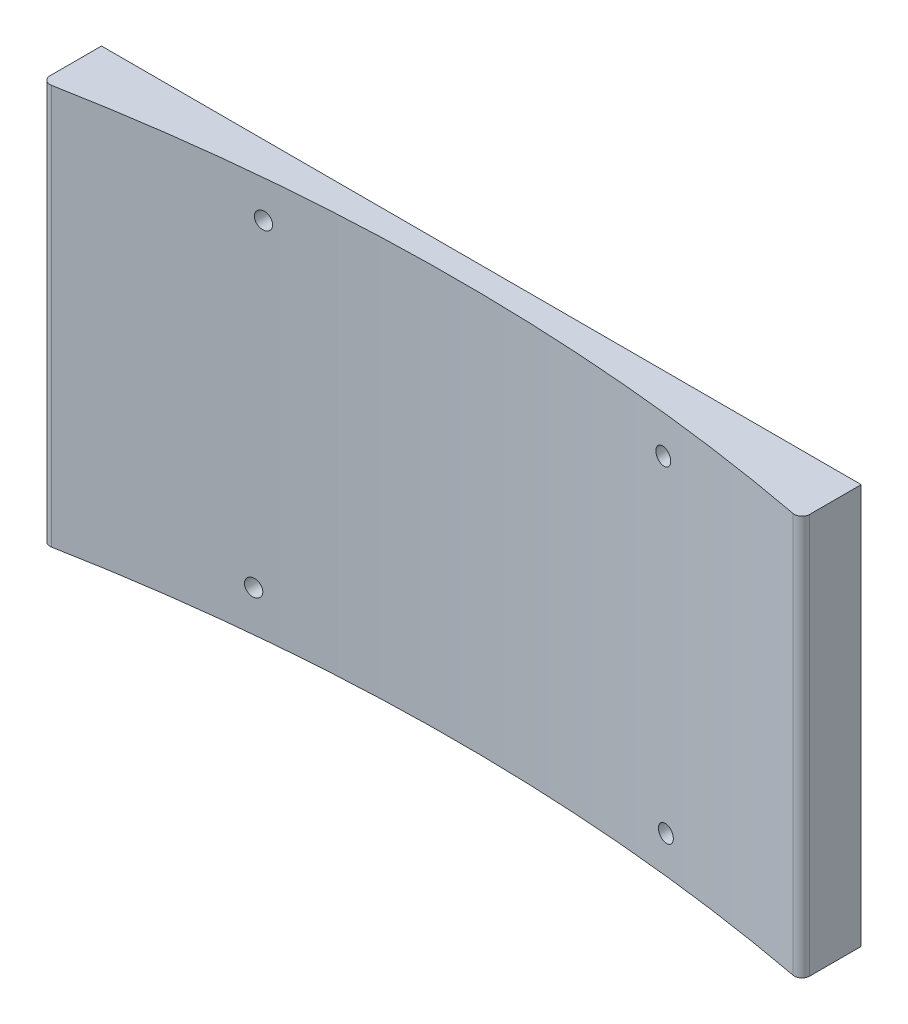
ISO-10303-21;
HEADER;
FILE_DESCRIPTION(('STEP AP214'),'2;1');
FILE_NAME('part.step','',(''),(''),'','','');
FILE_SCHEMA(('AUTOMOTIVE_DESIGN { 1 0 10303 214 1 1 1 1 }'));
ENDSEC;
DATA;
#1=APPLICATION_CONTEXT('core data for automotive mechanical design processes');
#2=APPLICATION_PROTOCOL_DEFINITION('international standard','automotive_design',2000,#1);
#3=PRODUCT_CONTEXT('',#1,'mechanical');
#4=PRODUCT('Part','Part','',(#3));
#5=PRODUCT_RELATED_PRODUCT_CATEGORY('part','',(#4));
#6=PRODUCT_DEFINITION_FORMATION('','',#4);
#7=PRODUCT_DEFINITION_CONTEXT('part definition',#1,'design');
#8=PRODUCT_DEFINITION('design','',#6,#7);
#9=PRODUCT_DEFINITION_SHAPE('','',#8);
#10=(LENGTH_UNIT() NAMED_UNIT(*) SI_UNIT(.MILLI.,.METRE.));
#11=(NAMED_UNIT(*) PLANE_ANGLE_UNIT() SI_UNIT($,.RADIAN.));
#12=(NAMED_UNIT(*) SI_UNIT($,.STERADIAN.) SOLID_ANGLE_UNIT());
#13=UNCERTAINTY_MEASURE_WITH_UNIT(LENGTH_MEASURE(1.E-05),#10,'distance_accuracy_value','');
#14=(GEOMETRIC_REPRESENTATION_CONTEXT(3) GLOBAL_UNCERTAINTY_ASSIGNED_CONTEXT((#13)) GLOBAL_UNIT_ASSIGNED_CONTEXT((#10,
#11,#12)) REPRESENTATION_CONTEXT('',''));
#15=CARTESIAN_POINT('',(0.,0.,0.));
#16=DIRECTION('',(0.,0.,1.));
#17=DIRECTION('',(1.,0.,0.));
#18=AXIS2_PLACEMENT_3D('',#15,#16,#17);
#19=CARTESIAN_POINT('',(-141.572,27.78,22.));
#20=DIRECTION('',(1.,0.,0.));
#21=DIRECTION('',(0.,0.,-1.));
#22=AXIS2_PLACEMENT_3D('',#19,#20,#21);
#23=PLANE('',#22);
#24=DIRECTION('',(0.,0.,1.));
#25=VECTOR('',#24,1.);
#26=CARTESIAN_POINT('',(-141.572,27.784,0.));
#27=LINE('',#26,#25);
#28=CARTESIAN_POINT('',(-141.572,27.782,22.));
#29=VERTEX_POINT('',#28);
#30=CARTESIAN_POINT('',(-141.572,27.784,26.7911007728322));
#31=VERTEX_POINT('',#30);
#32=EDGE_CURVE('E99',#29,#31,#27,.T.);
#33=ORIENTED_EDGE('',*,*,#32,.T.);
#34=DIRECTION('',(0.,1.,0.));
#35=VECTOR('',#34,1.);
#36=CARTESIAN_POINT('',(-141.572,27.78,26.7911007728322));
#37=LINE('',#36,#35);
#38=CARTESIAN_POINT('',(-141.572,80.424,26.7911007728322));
#39=VERTEX_POINT('',#38);
#40=EDGE_CURVE('E163',#31,#39,#37,.T.);
#41=ORIENTED_EDGE('',*,*,#40,.T.);
#42=DIRECTION('',(0.,0.,-1.));
#43=VECTOR('',#42,1.);
#44=CARTESIAN_POINT('',(-141.572,80.424,22.));
#45=LINE('',#44,#43);
#46=CARTESIAN_POINT('',(-141.572,80.424,20.));
#47=VERTEX_POINT('',#46);
#48=EDGE_CURVE('E105',#39,#47,#45,.T.);
#49=ORIENTED_EDGE('',*,*,#48,.T.);
#50=DIRECTION('',(0.,-1.,0.));
#51=VECTOR('',#50,1.);
#52=CARTESIAN_POINT('',(-141.572,27.78,20.));
#53=LINE('',#52,#51);
#54=CARTESIAN_POINT('',(-141.572,27.78,20.));
#55=VERTEX_POINT('',#54);
#56=EDGE_CURVE('E102',#47,#55,#53,.T.);
#57=ORIENTED_EDGE('',*,*,#56,.T.);
#58=DIRECTION('',(0.,0.,-1.));
#59=VECTOR('',#58,1.);
#60=CARTESIAN_POINT('',(-141.572,27.78,22.));
#61=LINE('',#60,#59);
#62=EDGE_CURVE('E95',#29,#55,#61,.T.);
#63=ORIENTED_EDGE('',*,*,#62,.F.);
#64=EDGE_LOOP('',(#33,#41,#49,#57,#63));
#65=FACE_BOUND('',#64,.T.);
#66=ADVANCED_FACE('F36',(#65),#23,.F.);
#67=CARTESIAN_POINT('',(-41.572,27.78,22.));
#68=DIRECTION('',(0.,1.,0.));
#69=DIRECTION('',(0.,0.,1.));
#70=AXIS2_PLACEMENT_3D('',#67,#68,#69);
#71=PLANE('',#70);
#72=DIRECTION('',(1.,0.,0.));
#73=VECTOR('',#72,1.);
#74=CARTESIAN_POINT('',(-41.572,27.78,20.));
#75=LINE('',#74,#73);
#76=CARTESIAN_POINT('',(-41.572,27.78,20.));
#77=VERTEX_POINT('',#76);
#78=EDGE_CURVE('E125',#55,#77,#75,.T.);
#79=ORIENTED_EDGE('',*,*,#78,.T.);
#80=DIRECTION('',(0.,0.,-1.));
#81=VECTOR('',#80,1.);
#82=CARTESIAN_POINT('',(-41.572,27.78,22.));
#83=LINE('',#82,#81);
#84=CARTESIAN_POINT('',(-41.572,27.782,22.));
#85=VERTEX_POINT('',#84);
#86=EDGE_CURVE('E106',#85,#77,#83,.T.);
#87=ORIENTED_EDGE('',*,*,#86,.F.);
#88=CARTESIAN_POINT('',(-141.572,27.784,22.));
#89=DIRECTION('',(1.,0.,0.));
#90=VECTOR('',#89,1.);
#91=LINE('',#88,#90);
#92=EDGE_CURVE('E109',#29,#85,#91,.T.);
#93=ORIENTED_EDGE('',*,*,#92,.F.);
#94=ORIENTED_EDGE('',*,*,#62,.T.);
#95=EDGE_LOOP('',(#79,#87,#93,#94));
#96=FACE_BOUND('',#95,.T.);
#97=ADVANCED_FACE('F111',(#96),#71,.F.);
#98=CARTESIAN_POINT('',(-41.572,80.424,22.));
#99=DIRECTION('',(-1.,0.,0.));
#100=DIRECTION('',(0.,0.,1.));
#101=AXIS2_PLACEMENT_3D('',#98,#99,#100);
#102=PLANE('',#101);
#103=DIRECTION('',(0.,0.,-1.));
#104=VECTOR('',#103,1.);
#105=CARTESIAN_POINT('',(-41.572,80.424,22.));
#106=LINE('',#105,#104);
#107=CARTESIAN_POINT('',(-41.572,80.424,26.7911007728322));
#108=VERTEX_POINT('',#107);
#109=CARTESIAN_POINT('',(-41.572,80.424,20.));
#110=VERTEX_POINT('',#109);
#111=EDGE_CURVE('E117',#108,#110,#106,.T.);
#112=ORIENTED_EDGE('',*,*,#111,.F.);
#113=DIRECTION('',(0.,1.,0.));
#114=VECTOR('',#113,1.);
#115=CARTESIAN_POINT('',(-41.572,80.424,26.7911007728322));
#116=LINE('',#115,#114);
#117=CARTESIAN_POINT('',(-41.572,27.784,26.7911007728322));
#118=VERTEX_POINT('',#117);
#119=EDGE_CURVE('E149',#108,#118,#116,.F.);
#120=ORIENTED_EDGE('',*,*,#119,.T.);
#121=DIRECTION('',(0.,0.,1.));
#122=VECTOR('',#121,1.);
#123=CARTESIAN_POINT('',(-41.572,27.784,0.));
#124=LINE('',#123,#122);
#125=EDGE_CURVE('E123',#85,#118,#124,.T.);
#126=ORIENTED_EDGE('',*,*,#125,.F.);
#127=ORIENTED_EDGE('',*,*,#86,.T.);
#128=DIRECTION('',(0.,1.,0.));
#129=VECTOR('',#128,1.);
#130=CARTESIAN_POINT('',(-41.572,80.424,20.));
#131=LINE('',#130,#129);
#132=EDGE_CURVE('E139',#77,#110,#131,.T.);
#133=ORIENTED_EDGE('',*,*,#132,.T.);
#134=EDGE_LOOP('',(#112,#120,#126,#127,#133));
#135=FACE_BOUND('',#134,.T.);
#136=ADVANCED_FACE('F173',(#135),#102,.F.);
#137=CARTESIAN_POINT('',(-121.572,80.424,22.));
#138=DIRECTION('',(0.,-1.,0.));
#139=DIRECTION('',(0.,0.,-1.));
#140=AXIS2_PLACEMENT_3D('',#137,#138,#139);
#141=PLANE('',#140);
#142=ORIENTED_EDGE('',*,*,#48,.F.);
#143=CARTESIAN_POINT('',(-140.572,80.424,26.7911007728322));
#144=DIRECTION('',(0.,-1.,0.));
#145=DIRECTION('',(0.,0.,-1.));
#146=AXIS2_PLACEMENT_3D('',#143,#144,#145);
#147=CIRCLE('',#146,1.);
#148=CARTESIAN_POINT('',(-140.386780302292,80.424,27.7737979100932));
#149=VERTEX_POINT('',#148);
#150=EDGE_CURVE('E58',#39,#149,#147,.F.);
#151=ORIENTED_EDGE('',*,*,#150,.T.);
#152=CARTESIAN_POINT('',(-91.572,80.424,286.764312703068));
#153=DIRECTION('',(0.,1.,0.));
#154=DIRECTION('',(0.,0.,1.));
#155=AXIS2_PLACEMENT_3D('',#152,#153,#154);
#156=CIRCLE('',#155,263.550696316081);
#157=CARTESIAN_POINT('',(-42.7572196977076,80.424,27.7737979100932));
#158=VERTEX_POINT('',#157);
#159=EDGE_CURVE('E187',#158,#149,#156,.T.);
#160=ORIENTED_EDGE('',*,*,#159,.F.);
#161=CARTESIAN_POINT('',(-42.572,80.424,26.7911007728322));
#162=DIRECTION('',(0.,-1.,0.));
#163=DIRECTION('',(0.,0.,-1.));
#164=AXIS2_PLACEMENT_3D('',#161,#162,#163);
#165=CIRCLE('',#164,1.);
#166=EDGE_CURVE('E146',#158,#108,#165,.F.);
#167=ORIENTED_EDGE('',*,*,#166,.T.);
#168=ORIENTED_EDGE('',*,*,#111,.T.);
#169=DIRECTION('',(-1.,0.,0.));
#170=VECTOR('',#169,1.);
#171=CARTESIAN_POINT('',(-121.572,80.424,20.));
#172=LINE('',#171,#170);
#173=EDGE_CURVE('E118',#110,#47,#172,.T.);
#174=ORIENTED_EDGE('',*,*,#173,.T.);
#175=EDGE_LOOP('',(#142,#151,#160,#167,#168,#174));
#176=FACE_BOUND('',#175,.T.);
#177=ADVANCED_FACE('F166',(#176),#141,.F.);
#178=CARTESIAN_POINT('',(0.,0.,20.));
#179=DIRECTION('',(0.,0.,-1.));
#180=DIRECTION('',(-1.,0.,0.));
#181=AXIS2_PLACEMENT_3D('',#178,#179,#180);
#182=PLANE('',#181);
#183=CARTESIAN_POINT('',(-117.094,33.147,20.));
#184=DIRECTION('',(0.,0.,-1.));
#185=DIRECTION('',(-1.,0.,0.));
#186=AXIS2_PLACEMENT_3D('',#183,#184,#185);
#187=CIRCLE('',#186,1.10000000000001);
#188=CARTESIAN_POINT('',(-118.194,33.147,20.));
#189=VERTEX_POINT('',#188);
#190=EDGE_CURVE('E242',#189,#189,#187,.T.);
#191=ORIENTED_EDGE('',*,*,#190,.F.);
#192=EDGE_LOOP('',(#191));
#193=FACE_BOUND('',#192,.T.);
#194=CARTESIAN_POINT('',(-115.905,75.538,20.));
#195=DIRECTION('',(0.,0.,-1.));
#196=DIRECTION('',(-1.,0.,0.));
#197=AXIS2_PLACEMENT_3D('',#194,#195,#196);
#198=CIRCLE('',#197,1.10000000000001);
#199=CARTESIAN_POINT('',(-117.005,75.538,20.));
#200=VERTEX_POINT('',#199);
#201=EDGE_CURVE('E239',#200,#200,#198,.T.);
#202=ORIENTED_EDGE('',*,*,#201,.F.);
#203=EDGE_LOOP('',(#202));
#204=FACE_BOUND('',#203,.T.);
#205=CARTESIAN_POINT('',(-62.836,75.44,20.));
#206=DIRECTION('',(0.,0.,-1.));
#207=DIRECTION('',(-1.,0.,0.));
#208=AXIS2_PLACEMENT_3D('',#205,#206,#207);
#209=CIRCLE('',#208,1.09999999999999);
#210=CARTESIAN_POINT('',(-63.936,75.44,20.));
#211=VERTEX_POINT('',#210);
#212=EDGE_CURVE('E235',#211,#211,#209,.T.);
#213=ORIENTED_EDGE('',*,*,#212,.F.);
#214=EDGE_LOOP('',(#213));
#215=FACE_BOUND('',#214,.T.);
#216=CARTESIAN_POINT('',(-62.455,32.641,20.));
#217=DIRECTION('',(0.,0.,-1.));
#218=DIRECTION('',(-1.,0.,0.));
#219=AXIS2_PLACEMENT_3D('',#216,#217,#218);
#220=CIRCLE('',#219,1.10000000000001);
#221=CARTESIAN_POINT('',(-63.555,32.641,20.));
#222=VERTEX_POINT('',#221);
#223=EDGE_CURVE('E188',#222,#222,#220,.T.);
#224=ORIENTED_EDGE('',*,*,#223,.F.);
#225=EDGE_LOOP('',(#224));
#226=FACE_BOUND('',#225,.T.);
#227=ORIENTED_EDGE('',*,*,#56,.F.);
#228=ORIENTED_EDGE('',*,*,#173,.F.);
#229=ORIENTED_EDGE('',*,*,#132,.F.);
#230=ORIENTED_EDGE('',*,*,#78,.F.);
#231=EDGE_LOOP('',(#227,#228,#229,#230));
#232=FACE_BOUND('',#231,.T.);
#233=ADVANCED_FACE('F171',(#193,#204,#215,#226,#232),#182,.T.);
#234=CARTESIAN_POINT('',(-91.572,27.784,286.764312703068));
#235=DIRECTION('',(0.,1.,0.));
#236=DIRECTION('',(0.,0.,1.));
#237=AXIS2_PLACEMENT_3D('',#234,#235,#236);
#238=CYLINDRICAL_SURFACE('',#237,263.550696316081);
#239=CARTESIAN_POINT('',(-118.194,33.147,24.5616455833548));
#240=CARTESIAN_POINT('',(-118.193997231463,33.2085555516964,24.5616452826476));
#241=CARTESIAN_POINT('',(-118.188815275005,33.2701558664589,24.5611190065985));
#242=CARTESIAN_POINT('',(-118.168220162618,33.3916556149782,24.5590291851556));
#243=CARTESIAN_POINT('',(-118.152794681111,33.4515529089121,24.5574643901593));
#244=CARTESIAN_POINT('',(-118.11216702735,33.5678642571947,24.5533490168651));
#245=CARTESIAN_POINT('',(-118.086970616105,33.624280341411,24.5507990194526));
#246=CARTESIAN_POINT('',(-118.027538686672,33.7320576020756,24.5447960968553));
#247=CARTESIAN_POINT('',(-117.993305321454,33.7834199785272,24.5413433867352));
#248=CARTESIAN_POINT('',(-117.916687870883,33.8797912786444,24.5336348043414));
#249=CARTESIAN_POINT('',(-117.874284206051,33.9247844804955,24.529377003197));
#250=CARTESIAN_POINT('',(-117.782590510787,34.0070210837525,24.5201962914735));
#251=CARTESIAN_POINT('',(-117.733300053025,34.0442640038915,24.515273339622));
#252=CARTESIAN_POINT('',(-117.628979975498,34.1101301747767,24.5048875536437));
#253=CARTESIAN_POINT('',(-117.573924036482,34.1387113516631,24.4994222502138));
#254=CARTESIAN_POINT('',(-117.459829283006,34.1862247188688,24.4881355404228));
#255=CARTESIAN_POINT('',(-117.400790374738,34.2051566818352,24.4823141256746));
#256=CARTESIAN_POINT('',(-117.280135861158,34.2329104330917,24.4704603790245));
#257=CARTESIAN_POINT('',(-117.218510394955,34.2416890283687,24.4644272577165));
#258=CARTESIAN_POINT('',(-117.094662129304,34.2487471394208,24.4523474454953));
#259=CARTESIAN_POINT('',(-117.032439322585,34.2470265272342,24.4463007544174));
#260=CARTESIAN_POINT('',(-116.909044590183,34.2331184430049,24.4343533958371));
#261=CARTESIAN_POINT('',(-116.847874764961,34.220912076518,24.4284530117256));
#262=CARTESIAN_POINT('',(-116.728443375217,34.186342593976,24.4169733096933));
#263=CARTESIAN_POINT('',(-116.670181806327,34.1639794931749,24.4113939912903));
#264=CARTESIAN_POINT('',(-116.558306184082,34.1097519809911,24.4007154011996));
#265=CARTESIAN_POINT('',(-116.50468629707,34.0778997260523,24.3956155262337));
#266=CARTESIAN_POINT('',(-116.403553915532,34.005573628476,24.3860246471818));
#267=CARTESIAN_POINT('',(-116.356041313138,33.9650999381437,24.3815336323419));
#268=CARTESIAN_POINT('',(-116.268660493225,33.8768337840004,24.373294539686));
#269=CARTESIAN_POINT('',(-116.228765188615,33.829068383156,24.3695438276853));
#270=CARTESIAN_POINT('',(-116.157565152103,33.727463374399,24.3628630160604));
#271=CARTESIAN_POINT('',(-116.126260216053,33.6736239108779,24.3599328969351));
#272=CARTESIAN_POINT('',(-116.073272261741,33.5616502174098,24.3549799901142));
#273=CARTESIAN_POINT('',(-116.051548094155,33.5035356305846,24.3529533216915));
#274=CARTESIAN_POINT('',(-116.018158371233,33.3844614243145,24.3498406302057));
#275=CARTESIAN_POINT('',(-116.006492608898,33.3235018634452,24.3487545877849));
#276=CARTESIAN_POINT('',(-115.993582447782,33.2006817207884,24.3475527920927));
#277=CARTESIAN_POINT('',(-115.992304119523,33.1388247342041,24.3474338797897));
#278=CARTESIAN_POINT('',(-116.000116767138,33.015775276309,24.3481610379342));
#279=CARTESIAN_POINT('',(-116.009207646917,32.9545827988453,24.349007099439));
#280=CARTESIAN_POINT('',(-116.037480100345,32.8346580115302,24.3516414934723));
#281=CARTESIAN_POINT('',(-116.056652153061,32.7759234367767,24.3534289369365));
#282=CARTESIAN_POINT('',(-116.104525117184,32.6625126426723,24.3579002153249));
#283=CARTESIAN_POINT('',(-116.133226076753,32.6078364438359,24.3605840547798));
#284=CARTESIAN_POINT('',(-116.199386536417,32.5039885877137,24.3667851562658));
#285=CARTESIAN_POINT('',(-116.236861044769,32.4548265787147,24.3703038465542));
#286=CARTESIAN_POINT('',(-116.319465520928,32.3634899173461,24.3780817466364));
#287=CARTESIAN_POINT('',(-116.364595627565,32.3213153917193,24.3823409698594));
#288=CARTESIAN_POINT('',(-116.46140737429,32.2449797059683,24.3915067615162));
#289=CARTESIAN_POINT('',(-116.513112885554,32.2108491053513,24.396415691415));
#290=CARTESIAN_POINT('',(-116.621471639376,32.1517483377242,24.40673904113));
#291=CARTESIAN_POINT('',(-116.678124993891,32.1267783780605,24.4121534723844));
#292=CARTESIAN_POINT('',(-116.795032399585,32.0865966875564,24.42336731843));
#293=CARTESIAN_POINT('',(-116.855300916384,32.0714274753744,24.4291682918143));
#294=CARTESIAN_POINT('',(-116.977510905045,32.0514342614529,24.4409753655783));
#295=CARTESIAN_POINT('',(-117.039452413934,32.0466104888699,24.4469814704987));
#296=CARTESIAN_POINT('',(-117.163453947144,32.0474400034424,24.459049877765));
#297=CARTESIAN_POINT('',(-117.225513745399,32.0531257447334,24.4651122964757));
#298=CARTESIAN_POINT('',(-117.347800493205,32.0748795790196,24.4771010175134));
#299=CARTESIAN_POINT('',(-117.408027425686,32.090947768671,24.4830273185727));
#300=CARTESIAN_POINT('',(-117.524963146518,32.1330307222448,24.4945723805497));
#301=CARTESIAN_POINT('',(-117.581670334874,32.1590499717546,24.5001910014685));
#302=CARTESIAN_POINT('',(-117.689912054842,32.2203092774189,24.5109482624326));
#303=CARTESIAN_POINT('',(-117.741446840695,32.2555488800562,24.5160869260685));
#304=CARTESIAN_POINT('',(-117.837728228947,32.3341530376848,24.5257125919688));
#305=CARTESIAN_POINT('',(-117.882492973918,32.3774951554188,24.5302013344835));
#306=CARTESIAN_POINT('',(-117.964115336735,32.4711611236489,24.53840348665));
#307=CARTESIAN_POINT('',(-118.000971167595,32.5214865477738,24.542116721074));
#308=CARTESIAN_POINT('',(-118.065546839812,32.6274500708933,24.5486332388768));
#309=CARTESIAN_POINT('',(-118.093304088928,32.6830651723755,24.5514402473604));
#310=CARTESIAN_POINT('',(-118.139053606155,32.7981607929505,24.5560715563347));
#311=CARTESIAN_POINT('',(-118.157057956815,32.8576364265352,24.5578970727433));
#312=CARTESIAN_POINT('',(-118.177930064706,32.9557514218628,24.560014352219));
#313=CARTESIAN_POINT('',(-118.183948554274,32.9937425314175,24.5606252015279));
#314=CARTESIAN_POINT('',(-118.191984380575,33.0701499445739,24.5614409103997));
#315=CARTESIAN_POINT('',(-118.194001728605,33.108566246975,24.5616457711088));
#316=CARTESIAN_POINT('',(-118.194,33.147,24.5616455833548));
#317=B_SPLINE_CURVE_WITH_KNOTS('',3,(#239,#240,#241,#242,#243,#244,#245,#246,#247,#248,#249,
#250,#251,#252,#253,#254,#255,#256,#257,#258,#259,#260,#261,#262,#263,#264,#265,#266,#267,#268,
#269,#270,#271,#272,#273,#274,#275,#276,#277,#278,#279,#280,#281,#282,#283,#284,#285,#286,#287,
#288,#289,#290,#291,#292,#293,#294,#295,#296,#297,#298,#299,#300,#301,#302,#303,#304,#305,#306,
#307,#308,#309,#310,#311,#312,#313,#314,#315,#316),.UNSPECIFIED.,.T.,.F.,(4,2,2,2,2,2,2,2,2,2,2,
2,2,2,2,2,2,2,2,2,2,2,2,2,2,2,2,2,2,2,2,2,2,2,2,2,2,2,4),(0.,0.184525987399434,0.36927441003708,
0.553914068957335,0.73850977883759,0.923553486941946,1.1086086822189,1.29454887220511,
1.48049344307725,1.66722615680288,1.85396114638611,2.04103332415001,2.22810522095865,
2.41493848525853,2.60176844925855,2.78792114081342,2.9740694081122,3.15941019311999,
3.34474716379537,3.52947850608815,3.71420813642038,3.89876361559019,4.08332002759258,
4.2681944835513,4.45307229249738,4.63864153556624,4.82421497864195,5.01058818460522,
5.19696551878358,5.3839193613811,5.57087494446169,5.75791490004815,5.94494565751492,
6.13146596717461,6.31802837606755,6.50381384317093,6.68936861718028,6.80458237214603,
6.91979580181995),.UNSPECIFIED.);
#318=CARTESIAN_POINT('',(-118.194,33.147,24.5616455833548));
#319=VERTEX_POINT('',#318);
#320=EDGE_CURVE('E152',#319,#319,#317,.T.);
#321=ORIENTED_EDGE('',*,*,#320,.T.);
#322=EDGE_LOOP('',(#321));
#323=FACE_BOUND('',#322,.T.);
#324=CARTESIAN_POINT('',(-117.005,75.538,24.4436462665649));
#325=CARTESIAN_POINT('',(-117.004997233954,75.5995759570914,24.4436459787746));
#326=CARTESIAN_POINT('',(-116.999811876755,75.6611966789202,24.443143097528));
#327=CARTESIAN_POINT('',(-116.979202826321,75.7827370561146,24.4411462151642));
#328=CARTESIAN_POINT('',(-116.963766800378,75.8426545716701,24.4396510201833));
#329=CARTESIAN_POINT('',(-116.923109885125,75.9590059801332,24.4357188157169));
#330=CARTESIAN_POINT('',(-116.897894667373,76.0154418703021,24.4332823521346));
#331=CARTESIAN_POINT('',(-116.838416091165,76.1232560460424,24.4275470088479));
#332=CARTESIAN_POINT('',(-116.804154895695,76.1746355366251,24.4242483353088));
#333=CARTESIAN_POINT('',(-116.727480006184,76.2710262035293,24.4168849731529));
#334=CARTESIAN_POINT('',(-116.685048327812,76.3160229439227,24.4128185951087));
#335=CARTESIAN_POINT('',(-116.593292397187,76.3982613767476,24.404051658889));
#336=CARTESIAN_POINT('',(-116.543967730686,76.4355026027617,24.3993510625997));
#337=CARTESIAN_POINT('',(-116.439596128151,76.5013434253326,24.3894378634571));
#338=CARTESIAN_POINT('',(-116.384525180269,76.529904635777,24.3842231175768));
#339=CARTESIAN_POINT('',(-116.270400728621,76.5773757999327,24.373455750539));
#340=CARTESIAN_POINT('',(-116.211347140158,76.5962855483186,24.3679031221963));
#341=CARTESIAN_POINT('',(-116.090688451282,76.6239861304578,24.3566010619431));
#342=CARTESIAN_POINT('',(-116.029074397446,76.6327376995432,24.3508509542443));
#343=CARTESIAN_POINT('',(-115.905252971229,76.6397464696237,24.3393401980518));
#344=CARTESIAN_POINT('',(-115.843045592436,76.6380035570649,24.3335795494448));
#345=CARTESIAN_POINT('',(-115.719697179104,76.6240577121621,24.3222008140075));
#346=CARTESIAN_POINT('',(-115.658558041183,76.6118377906626,24.3165829739934));
#347=CARTESIAN_POINT('',(-115.539190612602,76.5772519587465,24.3056552019203));
#348=CARTESIAN_POINT('',(-115.480962317895,76.5548860624409,24.300345269433));
#349=CARTESIAN_POINT('',(-115.369148197703,76.5006624171723,24.2901836584288));
#350=CARTESIAN_POINT('',(-115.315556986687,76.4688158753608,24.2853314477042));
#351=CARTESIAN_POINT('',(-115.214480668403,76.3965126008056,24.2762077995785));
#352=CARTESIAN_POINT('',(-115.166995462768,76.3560560067953,24.2719363528214));
#353=CARTESIAN_POINT('',(-115.07965025644,76.2678210666122,24.2640996951364));
#354=CARTESIAN_POINT('',(-115.039765624579,76.2200673073342,24.2605322015277));
#355=CARTESIAN_POINT('',(-114.968584282231,76.118492371144,24.2541783198878));
#356=CARTESIAN_POINT('',(-114.937287387215,76.0646713246378,24.2513919150729));
#357=CARTESIAN_POINT('',(-114.88429915411,75.9527169990297,24.2466810187101));
#358=CARTESIAN_POINT('',(-114.862570558194,75.894601493894,24.2447531836539));
#359=CARTESIAN_POINT('',(-114.829172738837,75.7755268931841,24.2417922815272));
#360=CARTESIAN_POINT('',(-114.817503328436,75.7145678504818,24.2407591978271));
#361=CARTESIAN_POINT('',(-114.804583710757,75.5917295846728,24.2396155303955));
#362=CARTESIAN_POINT('',(-114.803302839298,75.5298536101914,24.2395022317043));
#363=CARTESIAN_POINT('',(-114.81111680916,75.4067659036331,24.2401938235883));
#364=CARTESIAN_POINT('',(-114.820211563587,75.3455541659976,24.2409987064739));
#365=CARTESIAN_POINT('',(-114.848500037544,75.2255854617127,24.2435053867956));
#366=CARTESIAN_POINT('',(-114.867685154276,75.1668264499195,24.2452064201977));
#367=CARTESIAN_POINT('',(-114.915593804205,75.0533687710189,24.2494622050434));
#368=CARTESIAN_POINT('',(-114.944317380627,74.9986701223124,24.2520169603558));
#369=CARTESIAN_POINT('',(-115.010527658875,74.8947902032107,24.2579203008324));
#370=CARTESIAN_POINT('',(-115.048027928923,74.8456176518249,24.2612701152227));
#371=CARTESIAN_POINT('',(-115.130691490146,74.754264579742,24.2686759745392));
#372=CARTESIAN_POINT('',(-115.175854907294,74.7120841740103,24.2727320310753));
#373=CARTESIAN_POINT('',(-115.272723024761,74.6357578483001,24.2814606438742));
#374=CARTESIAN_POINT('',(-115.324449337022,74.6016395912783,24.2861352393034));
#375=CARTESIAN_POINT('',(-115.432851683135,74.5425672371199,24.295967480255));
#376=CARTESIAN_POINT('',(-115.489527818132,74.5176133273002,24.3011251356483));
#377=CARTESIAN_POINT('',(-115.606457861229,74.4774773504902,24.3118068642039));
#378=CARTESIAN_POINT('',(-115.666724886712,74.462333856245,24.3173322906639));
#379=CARTESIAN_POINT('',(-115.788929124715,74.4423902698988,24.3285803105591));
#380=CARTESIAN_POINT('',(-115.850866371165,74.4375903880906,24.3343029080006));
#381=CARTESIAN_POINT('',(-115.974838485835,74.4384656609651,24.3458017542829));
#382=CARTESIAN_POINT('',(-116.036873137607,74.4441703596585,24.3515781088434));
#383=CARTESIAN_POINT('',(-116.15910642265,74.4659534252579,24.3630026910293));
#384=CARTESIAN_POINT('',(-116.219305039904,74.48203188263,24.3686509175368));
#385=CARTESIAN_POINT('',(-116.336180520245,74.5241248188874,24.379655488823));
#386=CARTESIAN_POINT('',(-116.392855873476,74.5501435238895,24.385011708346));
#387=CARTESIAN_POINT('',(-116.501034174529,74.6113898757593,24.3952677690223));
#388=CARTESIAN_POINT('',(-116.552537371545,74.6466170786649,24.4001676321621));
#389=CARTESIAN_POINT('',(-116.648770973265,74.7251936383193,24.4093481581447));
#390=CARTESIAN_POINT('',(-116.693517867374,74.7685226231839,24.4136303273487));
#391=CARTESIAN_POINT('',(-116.775107555432,74.8621532932162,24.4214557714869));
#392=CARTESIAN_POINT('',(-116.811948546572,74.9124565644575,24.424998877885));
#393=CARTESIAN_POINT('',(-116.876514516122,75.018389925151,24.4312188599457));
#394=CARTESIAN_POINT('',(-116.904273135237,75.0739993485933,24.4338989316537));
#395=CARTESIAN_POINT('',(-116.950026478531,75.1890805409996,24.438321169194));
#396=CARTESIAN_POINT('',(-116.968033250251,75.2485474421662,24.4400644922753));
#397=CARTESIAN_POINT('',(-116.988916152367,75.3466691517508,24.4420872595642));
#398=CARTESIAN_POINT('',(-116.994939871028,75.3846766127003,24.4426710613796));
#399=CARTESIAN_POINT('',(-117.002982653287,75.4611168982614,24.4434506542327));
#400=CARTESIAN_POINT('',(-117.00500172722,75.499549721775,24.4436464462716));
#401=CARTESIAN_POINT('',(-117.005,75.538,24.4436462665649));
#402=B_SPLINE_CURVE_WITH_KNOTS('',3,(#324,#325,#326,#327,#328,#329,#330,#331,#332,#333,#334,
#335,#336,#337,#338,#339,#340,#341,#342,#343,#344,#345,#346,#347,#348,#349,#350,#351,#352,#353,
#354,#355,#356,#357,#358,#359,#360,#361,#362,#363,#364,#365,#366,#367,#368,#369,#370,#371,#372,
#373,#374,#375,#376,#377,#378,#379,#380,#381,#382,#383,#384,#385,#386,#387,#388,#389,#390,#391,
#392,#393,#394,#395,#396,#397,#398,#399,#400,#401),.UNSPECIFIED.,.T.,.F.,(4,2,2,2,2,2,2,2,2,2,2,
2,2,2,2,2,2,2,2,2,2,2,2,2,2,2,2,2,2,2,2,2,2,2,2,2,2,2,4),(0.,0.184587176837888,
0.369396836139225,0.554099472761089,0.738757985005446,0.923827700241749,1.10890854237467,
1.29479635074936,1.48068811354079,1.66729604056165,1.85390598674917,2.04081910672818,
2.22773196674757,2.41442474696918,2.60111451924783,2.78718859560227,2.9732586733733,
3.15859766740397,3.34393321667096,3.52872150525042,3.71350824625073,3.89813769731953,
4.0827679850476,4.26768560735739,4.45260626979494,4.63815250882843,4.82370254017005,
5.00997776201388,5.19625677092623,5.38306048778253,5.56986583371516,5.75675068886639,
5.9436265355447,6.13003865350694,6.31649323456753,6.5022491649637,6.68777508382071,
6.80303836118019,6.91830134110684),.UNSPECIFIED.);
#403=CARTESIAN_POINT('',(-117.005,75.538,24.4436462665649));
#404=VERTEX_POINT('',#403);
#405=EDGE_CURVE('E238',#404,#404,#402,.T.);
#406=ORIENTED_EDGE('',*,*,#405,.T.);
#407=EDGE_LOOP('',(#406));
#408=FACE_BOUND('',#407,.T.);
#409=CARTESIAN_POINT('',(-63.936,75.44,24.6665808687556));
#410=CARTESIAN_POINT('',(-63.9359972306839,75.5015318008768,24.6665811411518));
#411=CARTESIAN_POINT('',(-63.9308192443872,75.563108356319,24.667126975398));
#412=CARTESIAN_POINT('',(-63.9102402586942,75.6845611795672,24.6692981003756));
#413=CARTESIAN_POINT('',(-63.8948269441894,75.7444353084105,24.670924691471));
#414=CARTESIAN_POINT('',(-63.8542326700369,75.860701480246,24.675214652393));
#415=CARTESIAN_POINT('',(-63.8290574824249,75.9170955581375,24.677877409555));
#416=CARTESIAN_POINT('',(-63.7696786672178,76.0248309033064,24.6841697234509));
#417=CARTESIAN_POINT('',(-63.7354771975024,76.0761733742308,24.6877990491129));
#418=CARTESIAN_POINT('',(-63.6589342953477,76.1725116412385,24.6959403798393));
#419=CARTESIAN_POINT('',(-63.6165728328937,76.2174913376761,24.700454557405));
#420=CARTESIAN_POINT('',(-63.5249782504866,76.2997073715185,24.7102415330958));
#421=CARTESIAN_POINT('',(-63.4757446955775,76.3369432184194,24.7155143792401));
#422=CARTESIAN_POINT('',(-63.3715314981823,76.4028218125953,24.7267087958531));
#423=CARTESIAN_POINT('',(-63.3165231345684,76.4314185723697,24.7326336167118));
#424=CARTESIAN_POINT('',(-63.2025358795386,76.4789732682951,24.7449502170319));
#425=CARTESIAN_POINT('',(-63.1435568747422,76.4979309290721,24.7513420098278));
#426=CARTESIAN_POINT('',(-63.022971430751,76.5257672442228,24.7644535589632));
#427=CARTESIAN_POINT('',(-62.961352836515,76.534592529762,24.7711748591995));
#428=CARTESIAN_POINT('',(-62.8375209562282,76.5417460235405,24.7847273875736));
#429=CARTESIAN_POINT('',(-62.7753076584776,76.5400740248359,24.7915586178759));
#430=CARTESIAN_POINT('',(-62.6518555535585,76.526259659888,24.8051581722693));
#431=CARTESIAN_POINT('',(-62.5906202221277,76.5140859570079,24.8119262467506));
#432=CARTESIAN_POINT('',(-62.4710561630551,76.4795613847207,24.825181955424));
#433=CARTESIAN_POINT('',(-62.4127274459705,76.457210478352,24.8316695885975));
#434=CARTESIAN_POINT('',(-62.3006849703931,76.4029687677407,24.8441668115125));
#435=CARTESIAN_POINT('',(-62.2469678625332,76.3710849639026,24.8501767479612));
#436=CARTESIAN_POINT('',(-62.1456491904945,76.2986578318661,24.8615406487209));
#437=CARTESIAN_POINT('',(-62.0980475034503,76.2581146776868,24.8668946262108));
#438=CARTESIAN_POINT('',(-62.0105388567383,76.1697024511904,24.8767576744191));
#439=CARTESIAN_POINT('',(-61.9705992011503,76.1218661452327,24.8812703328339));
#440=CARTESIAN_POINT('',(-61.8993273973462,76.0200892642881,24.8893361970641));
#441=CARTESIAN_POINT('',(-61.8679949577859,75.9661488960038,24.8928894353546));
#442=CARTESIAN_POINT('',(-61.8150290933088,75.8540504545024,24.8989027673581));
#443=CARTESIAN_POINT('',(-61.7933372703422,75.7959203258388,24.9013694421015));
#444=CARTESIAN_POINT('',(-61.7600141997218,75.6768092977,24.9051610295625));
#445=CARTESIAN_POINT('',(-61.7483826301411,75.6158284895122,24.9064859788152));
#446=CARTESIAN_POINT('',(-61.7355583271155,75.4930769954557,24.9079468854591));
#447=CARTESIAN_POINT('',(-61.7343132270546,75.4313118464328,24.9080888074475));
#448=CARTESIAN_POINT('',(-61.742160962177,75.3084511603985,24.9071947041055));
#449=CARTESIAN_POINT('',(-61.7512536490922,75.247355613796,24.9061586956695));
#450=CARTESIAN_POINT('',(-61.7794867577232,75.1276618490634,24.9029450240514));
#451=CARTESIAN_POINT('',(-61.7986120266431,75.0690600084581,24.9007690825836));
#452=CARTESIAN_POINT('',(-61.8463412760037,74.9559068420373,24.8953467760966));
#453=CARTESIAN_POINT('',(-61.8749453442867,74.9013555537651,24.8921004011575));
#454=CARTESIAN_POINT('',(-61.9408939281306,74.7976840820237,24.8846300590681));
#455=CARTESIAN_POINT('',(-61.9782622501051,74.7485792376241,24.8804034295992));
#456=CARTESIAN_POINT('',(-62.0606204132346,74.6573353629784,24.87110981967));
#457=CARTESIAN_POINT('',(-62.105610470063,74.6151965299173,24.8660428154295));
#458=CARTESIAN_POINT('',(-62.2022060777979,74.5388244354332,24.8551927692433));
#459=CARTESIAN_POINT('',(-62.2538475795475,74.5046371987011,24.8494058424114));
#460=CARTESIAN_POINT('',(-62.3620790279241,74.4454122864889,24.837313317456));
#461=CARTESIAN_POINT('',(-62.418669133306,74.4203749046766,24.8310077026929));
#462=CARTESIAN_POINT('',(-62.5355503463159,74.3800118490699,24.8180250890365));
#463=CARTESIAN_POINT('',(-62.5958612644617,74.3647441628916,24.8113461239088));
#464=CARTESIAN_POINT('',(-62.7181769889129,74.3445731362135,24.7978449803982));
#465=CARTESIAN_POINT('',(-62.7801818383544,74.3396700598993,24.7910227983692));
#466=CARTESIAN_POINT('',(-62.9043541012947,74.3403656460165,24.7774055462854));
#467=CARTESIAN_POINT('',(-62.9665213339345,74.3460007439741,24.7706106519985));
#468=CARTESIAN_POINT('',(-63.0890377669325,74.3676930874195,24.7572628172046));
#469=CARTESIAN_POINT('',(-63.1493869568968,74.3837503924798,24.7507098780809));
#470=CARTESIAN_POINT('',(-63.2665255703229,74.4258404324238,24.7380294445207));
#471=CARTESIAN_POINT('',(-63.323316194739,74.4518697805879,24.7319018064766));
#472=CARTESIAN_POINT('',(-63.4317249521685,74.513183255618,24.7202373553035));
#473=CARTESIAN_POINT('',(-63.4833433735566,74.5484668661181,24.714700509234));
#474=CARTESIAN_POINT('',(-63.5797218253443,74.6271453639265,24.7043878089009));
#475=CARTESIAN_POINT('',(-63.6245080235448,74.6705078139291,24.6996090481695));
#476=CARTESIAN_POINT('',(-63.7061701348162,74.7642286229921,24.6909131640002));
#477=CARTESIAN_POINT('',(-63.7430442970649,74.8145885264368,24.6869962312678));
#478=CARTESIAN_POINT('',(-63.8076190057582,74.9205864768729,24.6801473492487));
#479=CARTESIAN_POINT('',(-63.8353647055281,74.9761967381148,24.6772105507215));
#480=CARTESIAN_POINT('',(-63.8810942806085,75.0912840491991,24.6723750112579));
#481=CARTESIAN_POINT('',(-63.899090258944,75.1507562017666,24.6704749832832));
#482=CARTESIAN_POINT('',(-63.9199465380388,75.2488488556519,24.668273954819));
#483=CARTESIAN_POINT('',(-63.9259588421713,75.2868206630911,24.6676397872559));
#484=CARTESIAN_POINT('',(-63.9339864317515,75.3631891668601,24.6667931598121));
#485=CARTESIAN_POINT('',(-63.9360017288766,75.4015858619482,24.6665806986993));
#486=CARTESIAN_POINT('',(-63.936,75.44,24.6665808687556));
#487=B_SPLINE_CURVE_WITH_KNOTS('',3,(#409,#410,#411,#412,#413,#414,#415,#416,#417,#418,#419,
#420,#421,#422,#423,#424,#425,#426,#427,#428,#429,#430,#431,#432,#433,#434,#435,#436,#437,#438,
#439,#440,#441,#442,#443,#444,#445,#446,#447,#448,#449,#450,#451,#452,#453,#454,#455,#456,#457,
#458,#459,#460,#461,#462,#463,#464,#465,#466,#467,#468,#469,#470,#471,#472,#473,#474,#475,#476,
#477,#478,#479,#480,#481,#482,#483,#484,#485,#486),.UNSPECIFIED.,.T.,.F.,(4,2,2,2,2,2,2,2,2,2,2,
2,2,2,2,2,2,2,2,2,2,2,2,2,2,2,2,2,2,2,2,2,2,2,2,2,2,2,4),(0.,0.184454796622947,
0.369131931659996,0.553700036231084,0.738224056695878,0.923206929808601,1.10820151637459,
1.29416418235238,1.48013216069742,1.66707523204808,1.85402198881254,2.04152852393179,
2.22903574004265,2.41640559856223,2.60377169203313,2.79031953608309,2.97686106492752,
3.16225668161997,3.3476463654557,3.53210078106168,3.71655255119074,3.90072653174204,
4.08490221912612,4.26958410000954,4.45427120773484,4.64000208481531,4.82573892246816,
5.01256821051849,5.19940226063721,5.38688348031378,5.57436577162827,5.76178444630448,
5.9491926656899,6.13586403485939,6.32257666927182,6.50835134839457,6.69389488063993,
6.80904985127528,6.92420448547784),.UNSPECIFIED.);
#488=CARTESIAN_POINT('',(-63.936,75.44,24.6665808687556));
#489=VERTEX_POINT('',#488);
#490=EDGE_CURVE('E189',#489,#489,#487,.T.);
#491=ORIENTED_EDGE('',*,*,#490,.T.);
#492=EDGE_LOOP('',(#491));
#493=FACE_BOUND('',#492,.T.);
#494=CARTESIAN_POINT('',(-63.555,32.641,24.7070341556269));
#495=CARTESIAN_POINT('',(-63.5549972298463,32.7025247257292,24.707034432184));
#496=CARTESIAN_POINT('',(-63.5498204221505,32.764094205662,24.7075877528779));
#497=CARTESIAN_POINT('',(-63.5292462645914,32.8855329478451,24.7097886160212));
#498=CARTESIAN_POINT('',(-63.5138366020338,32.9454000711254,24.7114374766816));
#499=CARTESIAN_POINT('',(-63.4732524558674,33.0616523744832,24.7157860345457));
#500=CARTESIAN_POINT('',(-63.4480837739257,33.1180396002915,24.718485107409));
#501=CARTESIAN_POINT('',(-63.3887210997845,33.2257621601608,24.7248629899887));
#502=CARTESIAN_POINT('',(-63.3545292622429,33.2770986962741,24.7285415658094));
#503=CARTESIAN_POINT('',(-63.2780063682034,33.373430085063,24.7367932832031));
#504=CARTESIAN_POINT('',(-63.2356547512967,33.4184084096363,24.7413686850482));
#505=CARTESIAN_POINT('',(-63.1440821157353,33.5006235209446,24.7512879691911));
#506=CARTESIAN_POINT('',(-63.094860657739,33.53785981218,24.7566319006386));
#507=CARTESIAN_POINT('',(-62.9906660016494,33.6037469153336,24.7679775525314));
#508=CARTESIAN_POINT('',(-62.9356632903729,33.6323504707638,24.7739826564582));
#509=CARTESIAN_POINT('',(-62.8216874166746,33.679919653945,24.786465664759));
#510=CARTESIAN_POINT('',(-62.7627141376216,33.6988849984441,24.7929435830219));
#511=CARTESIAN_POINT('',(-62.642131125285,33.7267400327928,24.8062322546714));
#512=CARTESIAN_POINT('',(-62.5805089043653,33.7355749129665,24.8130446125862));
#513=CARTESIAN_POINT('',(-62.4566684917333,33.7427460813169,24.8267803008847));
#514=CARTESIAN_POINT('',(-62.3944502879638,33.7410821566422,24.8337036335153));
#515=CARTESIAN_POINT('',(-62.2709821309013,33.7272816588577,24.8474866844417));
#516=CARTESIAN_POINT('',(-62.2097357389039,33.7151129320656,24.8543461420036));
#517=CARTESIAN_POINT('',(-62.0901486789048,33.6805944687748,24.867780472723));
#518=CARTESIAN_POINT('',(-62.0318080215924,33.658244694826,24.8743553448335));
#519=CARTESIAN_POINT('',(-61.9197428021109,33.6040015471238,24.8870201541778));
#520=CARTESIAN_POINT('',(-61.8660147823751,33.5721154035227,24.8931104543845));
#521=CARTESIAN_POINT('',(-61.7646748300804,33.4996792585352,24.9046260388652));
#522=CARTESIAN_POINT('',(-61.7170627713023,33.4591294359931,24.9100513368631));
#523=CARTESIAN_POINT('',(-61.6295404493767,33.3707047243985,24.9200449008431));
#524=CARTESIAN_POINT('',(-61.589596598294,33.3228635072241,24.9246169018281));
#525=CARTESIAN_POINT('',(-61.5183175375313,33.2210741054052,24.9327886450549));
#526=CARTESIAN_POINT('',(-61.4869820286252,33.1671261331235,24.936388421091));
#527=CARTESIAN_POINT('',(-61.4340165804187,33.055019397364,24.9424797825692));
#528=CARTESIAN_POINT('',(-61.4123266998907,32.9968893239961,24.9449782112852));
#529=CARTESIAN_POINT('',(-61.3790072990923,32.8777778474889,24.9488185009028));
#530=CARTESIAN_POINT('',(-61.36737744853,32.8167965380309,24.9501603997757));
#531=CARTESIAN_POINT('',(-61.3545575508263,32.6940520003629,24.9516397043942));
#532=CARTESIAN_POINT('',(-61.3533137909133,32.6322944514594,24.951783307252));
#533=CARTESIAN_POINT('',(-61.3611616389404,32.5094491337587,24.9508776213791));
#534=CARTESIAN_POINT('',(-61.3702530948828,32.4483613551247,24.9498283501916));
#535=CARTESIAN_POINT('',(-61.3984803959812,32.3286854336816,24.9465737267046));
#536=CARTESIAN_POINT('',(-61.4176007080718,32.2700935764092,24.9443701622244));
#537=CARTESIAN_POINT('',(-61.4653161784998,32.156959611645,24.9388790810297));
#538=CARTESIAN_POINT('',(-61.4939114268533,32.1024175426341,24.9355915540171));
#539=CARTESIAN_POINT('',(-61.5598405981042,31.9987592339048,24.92802622506));
#540=CARTESIAN_POINT('',(-61.5971989234418,31.9496587199282,24.9237456581818));
#541=CARTESIAN_POINT('',(-61.6795341156869,31.8584216640328,24.9143332785691));
#542=CARTESIAN_POINT('',(-61.7245112034839,31.8162853240952,24.9092014411541));
#543=CARTESIAN_POINT('',(-61.8210851312205,31.7399097148999,24.8982114908841));
#544=CARTESIAN_POINT('',(-61.8727188340607,31.7057176404964,24.8923493403038));
#545=CARTESIAN_POINT('',(-61.980934024642,31.6464816658836,24.8800991565474));
#546=CARTESIAN_POINT('',(-62.0375156753387,31.6214380671105,24.8737111060516));
#547=CARTESIAN_POINT('',(-62.1543889692098,31.5810573772759,24.8605571635708));
#548=CARTESIAN_POINT('',(-62.2147009480926,31.5657797991845,24.8537892233098));
#549=CARTESIAN_POINT('',(-62.3370200004334,31.5455898496762,24.8401075228042));
#550=CARTESIAN_POINT('',(-62.3990271181644,31.5406777492429,24.8331937587522));
#551=CARTESIAN_POINT('',(-62.523211503671,31.541356281989,24.8193922861281));
#552=CARTESIAN_POINT('',(-62.5853885909843,31.5469843804728,24.8125047580309));
#553=CARTESIAN_POINT('',(-62.7079259987371,31.5686661728066,24.7989742286299));
#554=CARTESIAN_POINT('',(-62.7682863085219,31.5847199277871,24.7923312287601));
#555=CARTESIAN_POINT('',(-62.8854477854894,31.6268067934935,24.7794758795111));
#556=CARTESIAN_POINT('',(-62.9422501617199,31.6528364925803,24.773263383762));
#557=CARTESIAN_POINT('',(-63.0506823399124,31.7141551009243,24.7614368681186));
#558=CARTESIAN_POINT('',(-63.1023124324309,31.749443489665,24.7558228146051));
#559=CARTESIAN_POINT('',(-63.1987080958428,31.8281322817702,24.7453664781707));
#560=CARTESIAN_POINT('',(-63.2435004984942,31.8714994124556,24.7405211754869));
#561=CARTESIAN_POINT('',(-63.3251739622033,31.9652327807994,24.7317039692943));
#562=CARTESIAN_POINT('',(-63.3620532782302,32.0156005582459,24.7277322584294));
#563=CARTESIAN_POINT('',(-63.4266311215201,32.1216090636055,24.7207880889937));
#564=CARTESIAN_POINT('',(-63.4543761631897,32.1772211607324,24.7178105665854));
#565=CARTESIAN_POINT('',(-63.5001041023963,32.2923131718987,24.7129079683236));
#566=CARTESIAN_POINT('',(-63.518099114926,32.3517881825994,24.7109815863442));
#567=CARTESIAN_POINT('',(-63.5389514924418,32.4498781760769,24.7087503130707));
#568=CARTESIAN_POINT('',(-63.5449619347255,32.4878441590538,24.7081075055561));
#569=CARTESIAN_POINT('',(-63.5529870471714,32.5642009483767,24.7072493411524));
#570=CARTESIAN_POINT('',(-63.5550017293331,32.6025917534466,24.7070339829796));
#571=CARTESIAN_POINT('',(-63.555,32.641,24.7070341556269));
#572=B_SPLINE_CURVE_WITH_KNOTS('',3,(#494,#495,#496,#497,#498,#499,#500,#501,#502,#503,#504,
#505,#506,#507,#508,#509,#510,#511,#512,#513,#514,#515,#516,#517,#518,#519,#520,#521,#522,#523,
#524,#525,#526,#527,#528,#529,#530,#531,#532,#533,#534,#535,#536,#537,#538,#539,#540,#541,#542,
#543,#544,#545,#546,#547,#548,#549,#550,#551,#552,#553,#554,#555,#556,#557,#558,#559,#560,#561,
#562,#563,#564,#565,#566,#567,#568,#569,#570,#571),.UNSPECIFIED.,.T.,.F.,(4,2,2,2,2,2,2,2,2,2,2,
2,2,2,2,2,2,2,2,2,2,2,2,2,2,2,2,2,2,2,2,2,2,2,2,2,2,2,4),(0.,0.184433581418916,
0.369089485843455,0.553635781549699,0.738138048876341,0.923111439412155,1.1080966648304,
1.29407688075808,1.48006256203795,1.667049818081,1.85404086508995,2.04160630229026,
2.22917242943932,2.41659670925937,2.60401712045409,2.79059687100383,2.97717013521843,
3.16256718941645,3.34795815641132,3.5323897567094,3.71681864464777,3.9009627221059,
4.08510854906435,4.269773383417,4.45444357264285,4.64018428471607,4.82593111627204,
5.01279933967564,5.19967244829543,5.38721106137333,5.57475077408854,5.76222640788642,
5.94969150420509,6.1364009343382,6.32315149628095,6.50893580497793,6.69448873307747,
6.8096260483121,6.92476301778107),.UNSPECIFIED.);
#573=CARTESIAN_POINT('',(-63.555,32.641,24.7070341556269));
#574=VERTEX_POINT('',#573);
#575=EDGE_CURVE('E180',#574,#574,#572,.T.);
#576=ORIENTED_EDGE('',*,*,#575,.T.);
#577=EDGE_LOOP('',(#576));
#578=FACE_BOUND('',#577,.T.);
#579=ORIENTED_EDGE('',*,*,#159,.T.);
#580=DIRECTION('',(0.,1.,0.));
#581=VECTOR('',#580,1.);
#582=CARTESIAN_POINT('',(-140.386780302292,27.784,27.7737979100933));
#583=LINE('',#582,#581);
#584=CARTESIAN_POINT('',(-140.386780302292,27.784,27.7737979100932));
#585=VERTEX_POINT('',#584);
#586=EDGE_CURVE('E44',#149,#585,#583,.F.);
#587=ORIENTED_EDGE('',*,*,#586,.T.);
#588=CARTESIAN_POINT('',(-91.572,27.784,286.764312703068));
#589=DIRECTION('',(0.,1.,0.));
#590=DIRECTION('',(0.,0.,1.));
#591=AXIS2_PLACEMENT_3D('',#588,#589,#590);
#592=CIRCLE('',#591,263.550696316081);
#593=CARTESIAN_POINT('',(-42.7572196977076,27.784,27.7737979100932));
#594=VERTEX_POINT('',#593);
#595=EDGE_CURVE('E127',#594,#585,#592,.T.);
#596=ORIENTED_EDGE('',*,*,#595,.F.);
#597=DIRECTION('',(0.,1.,0.));
#598=VECTOR('',#597,1.);
#599=CARTESIAN_POINT('',(-42.7572196977076,27.784,27.7737979100933));
#600=LINE('',#599,#598);
#601=EDGE_CURVE('E144',#594,#158,#600,.T.);
#602=ORIENTED_EDGE('',*,*,#601,.T.);
#603=EDGE_LOOP('',(#579,#587,#596,#602));
#604=FACE_BOUND('',#603,.T.);
#605=ADVANCED_FACE('F194',(#323,#408,#493,#578,#604),#238,.F.);
#606=CARTESIAN_POINT('',(0.,27.784,0.));
#607=DIRECTION('',(0.,1.,0.));
#608=DIRECTION('',(0.,0.,1.));
#609=AXIS2_PLACEMENT_3D('',#606,#607,#608);
#610=PLANE('',#609);
#611=ORIENTED_EDGE('',*,*,#595,.T.);
#612=CARTESIAN_POINT('',(-140.572,27.784,26.7911007728322));
#613=DIRECTION('',(0.,1.,0.));
#614=DIRECTION('',(0.,0.,1.));
#615=AXIS2_PLACEMENT_3D('',#612,#613,#614);
#616=CIRCLE('',#615,1.);
#617=EDGE_CURVE('E11',#585,#31,#616,.F.);
#618=ORIENTED_EDGE('',*,*,#617,.T.);
#619=ORIENTED_EDGE('',*,*,#32,.F.);
#620=ORIENTED_EDGE('',*,*,#92,.T.);
#621=ORIENTED_EDGE('',*,*,#125,.T.);
#622=CARTESIAN_POINT('',(-42.572,27.784,26.7911007728322));
#623=DIRECTION('',(0.,1.,0.));
#624=DIRECTION('',(0.,0.,1.));
#625=AXIS2_PLACEMENT_3D('',#622,#623,#624);
#626=CIRCLE('',#625,1.);
#627=EDGE_CURVE('E161',#118,#594,#626,.F.);
#628=ORIENTED_EDGE('',*,*,#627,.T.);
#629=EDGE_LOOP('',(#611,#618,#619,#620,#621,#628));
#630=FACE_BOUND('',#629,.T.);
#631=ADVANCED_FACE('F121',(#630),#610,.F.);
#632=CARTESIAN_POINT('',(-62.455,32.641,39.64));
#633=DIRECTION('',(0.,0.,-1.));
#634=DIRECTION('',(-1.,0.,0.));
#635=AXIS2_PLACEMENT_3D('',#632,#633,#634);
#636=CYLINDRICAL_SURFACE('',#635,1.10000000000001);
#637=ORIENTED_EDGE('',*,*,#223,.T.);
#638=EDGE_LOOP('',(#637));
#639=FACE_BOUND('',#638,.T.);
#640=ORIENTED_EDGE('',*,*,#575,.F.);
#641=EDGE_LOOP('',(#640));
#642=FACE_BOUND('',#641,.T.);
#643=ADVANCED_FACE('F197',(#639,#642),#636,.F.);
#644=CARTESIAN_POINT('',(-62.836,75.44,39.64));
#645=DIRECTION('',(0.,0.,-1.));
#646=DIRECTION('',(-1.,0.,0.));
#647=AXIS2_PLACEMENT_3D('',#644,#645,#646);
#648=CYLINDRICAL_SURFACE('',#647,1.09999999999999);
#649=ORIENTED_EDGE('',*,*,#212,.T.);
#650=EDGE_LOOP('',(#649));
#651=FACE_BOUND('',#650,.T.);
#652=ORIENTED_EDGE('',*,*,#490,.F.);
#653=EDGE_LOOP('',(#652));
#654=FACE_BOUND('',#653,.T.);
#655=ADVANCED_FACE('F200',(#651,#654),#648,.F.);
#656=CARTESIAN_POINT('',(-115.905,75.538,39.64));
#657=DIRECTION('',(0.,0.,-1.));
#658=DIRECTION('',(-1.,0.,0.));
#659=AXIS2_PLACEMENT_3D('',#656,#657,#658);
#660=CYLINDRICAL_SURFACE('',#659,1.10000000000001);
#661=ORIENTED_EDGE('',*,*,#201,.T.);
#662=EDGE_LOOP('',(#661));
#663=FACE_BOUND('',#662,.T.);
#664=ORIENTED_EDGE('',*,*,#405,.F.);
#665=EDGE_LOOP('',(#664));
#666=FACE_BOUND('',#665,.T.);
#667=ADVANCED_FACE('F226',(#663,#666),#660,.F.);
#668=CARTESIAN_POINT('',(-117.094,33.147,39.64));
#669=DIRECTION('',(0.,0.,-1.));
#670=DIRECTION('',(-1.,0.,0.));
#671=AXIS2_PLACEMENT_3D('',#668,#669,#670);
#672=CYLINDRICAL_SURFACE('',#671,1.10000000000001);
#673=ORIENTED_EDGE('',*,*,#190,.T.);
#674=EDGE_LOOP('',(#673));
#675=FACE_BOUND('',#674,.T.);
#676=ORIENTED_EDGE('',*,*,#320,.F.);
#677=EDGE_LOOP('',(#676));
#678=FACE_BOUND('',#677,.T.);
#679=ADVANCED_FACE('F220',(#675,#678),#672,.F.);
#680=CARTESIAN_POINT('',(-42.572,27.784,26.7911007728322));
#681=DIRECTION('',(0.,1.,0.));
#682=DIRECTION('',(0.,0.,1.));
#683=AXIS2_PLACEMENT_3D('',#680,#681,#682);
#684=CYLINDRICAL_SURFACE('',#683,1.);
#685=ORIENTED_EDGE('',*,*,#627,.F.);
#686=ORIENTED_EDGE('',*,*,#119,.F.);
#687=ORIENTED_EDGE('',*,*,#166,.F.);
#688=ORIENTED_EDGE('',*,*,#601,.F.);
#689=EDGE_LOOP('',(#685,#686,#687,#688));
#690=FACE_BOUND('',#689,.T.);
#691=ADVANCED_FACE('F218',(#690),#684,.T.);
#692=CARTESIAN_POINT('',(-140.572,27.784,26.7911007728322));
#693=DIRECTION('',(0.,1.,0.));
#694=DIRECTION('',(0.,0.,1.));
#695=AXIS2_PLACEMENT_3D('',#692,#693,#694);
#696=CYLINDRICAL_SURFACE('',#695,1.);
#697=ORIENTED_EDGE('',*,*,#617,.F.);
#698=ORIENTED_EDGE('',*,*,#586,.F.);
#699=ORIENTED_EDGE('',*,*,#150,.F.);
#700=ORIENTED_EDGE('',*,*,#40,.F.);
#701=EDGE_LOOP('',(#697,#698,#699,#700));
#702=FACE_BOUND('',#701,.T.);
#703=ADVANCED_FACE('F38',(#702),#696,.T.);
#704=CLOSED_SHELL('',(#66,#97,#136,#177,#233,#605,#631,#643,#655,#667,#679,#691,#703));
#705=MANIFOLD_SOLID_BREP('B2',#704);
#706=ADVANCED_BREP_SHAPE_REPRESENTATION('',(#18,#705),#14);
#707=SHAPE_DEFINITION_REPRESENTATION(#9,#706);
ENDSEC;
END-ISO-10303-21;
